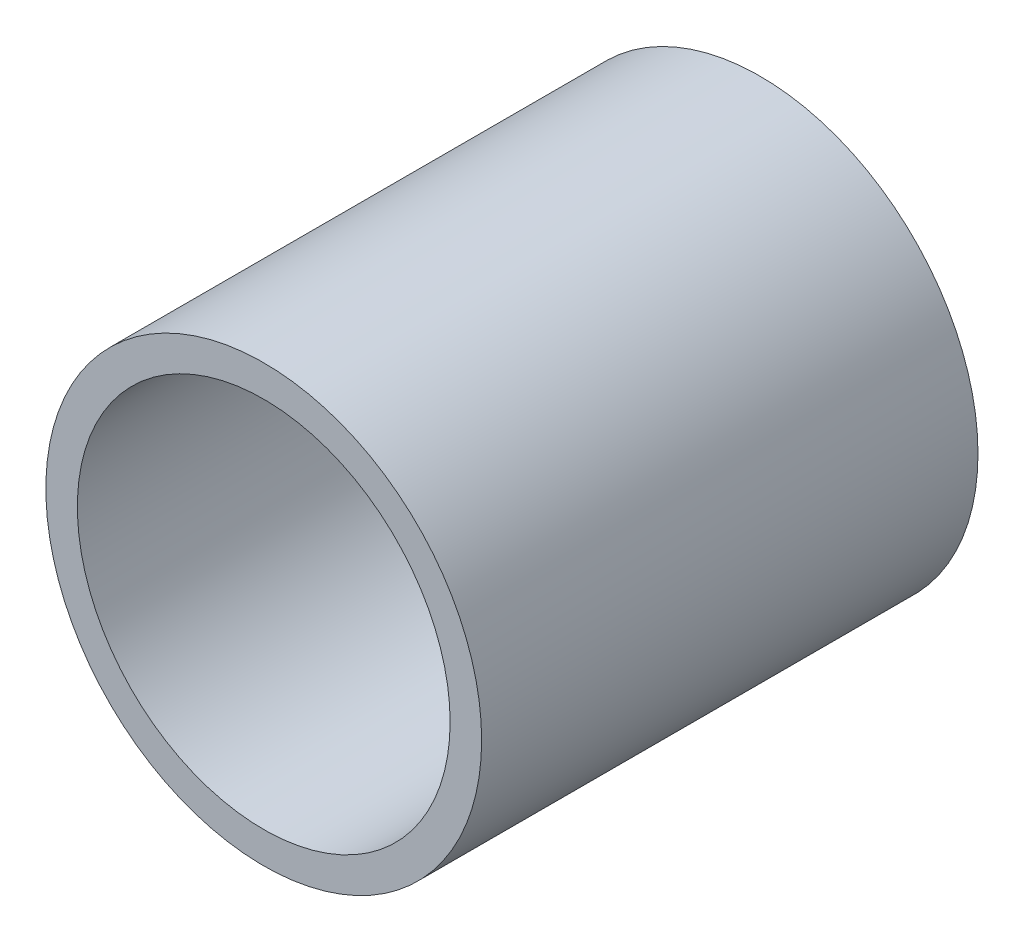
ISO-10303-21;
HEADER;
FILE_DESCRIPTION(('STEP AP214'),'2;1');
FILE_NAME('part.step','',(''),(''),'','','');
FILE_SCHEMA(('AUTOMOTIVE_DESIGN { 1 0 10303 214 1 1 1 1 }'));
ENDSEC;
DATA;
#1=APPLICATION_CONTEXT('core data for automotive mechanical design processes');
#2=APPLICATION_PROTOCOL_DEFINITION('international standard','automotive_design',2000,#1);
#3=PRODUCT_CONTEXT('',#1,'mechanical');
#4=PRODUCT('Part','Part','',(#3));
#5=PRODUCT_RELATED_PRODUCT_CATEGORY('part','',(#4));
#6=PRODUCT_DEFINITION_FORMATION('','',#4);
#7=PRODUCT_DEFINITION_CONTEXT('part definition',#1,'design');
#8=PRODUCT_DEFINITION('design','',#6,#7);
#9=PRODUCT_DEFINITION_SHAPE('','',#8);
#10=(LENGTH_UNIT() NAMED_UNIT(*) SI_UNIT(.MILLI.,.METRE.));
#11=(NAMED_UNIT(*) PLANE_ANGLE_UNIT() SI_UNIT($,.RADIAN.));
#12=(NAMED_UNIT(*) SI_UNIT($,.STERADIAN.) SOLID_ANGLE_UNIT());
#13=UNCERTAINTY_MEASURE_WITH_UNIT(LENGTH_MEASURE(1.E-05),#10,'distance_accuracy_value','');
#14=(GEOMETRIC_REPRESENTATION_CONTEXT(3) GLOBAL_UNCERTAINTY_ASSIGNED_CONTEXT((#13)) GLOBAL_UNIT_ASSIGNED_CONTEXT((#10,
#11,#12)) REPRESENTATION_CONTEXT('',''));
#15=CARTESIAN_POINT('',(0.,0.,0.));
#16=DIRECTION('',(0.,0.,1.));
#17=DIRECTION('',(1.,0.,0.));
#18=AXIS2_PLACEMENT_3D('',#15,#16,#17);
#19=CARTESIAN_POINT('',(0.,0.,12.7));
#20=DIRECTION('',(0.,0.,1.));
#21=DIRECTION('',(1.,0.,0.));
#22=AXIS2_PLACEMENT_3D('',#19,#20,#21);
#23=PLANE('',#22);
#24=CARTESIAN_POINT('',(0.,0.,12.7));
#25=DIRECTION('',(0.,0.,1.));
#26=DIRECTION('',(1.,0.,0.));
#27=AXIS2_PLACEMENT_3D('',#24,#25,#26);
#28=CIRCLE('',#27,11.1506);
#29=CARTESIAN_POINT('',(11.1506,0.,12.7));
#30=VERTEX_POINT('',#29);
#31=EDGE_CURVE('E10',#30,#30,#28,.T.);
#32=ORIENTED_EDGE('',*,*,#31,.T.);
#33=EDGE_LOOP('',(#32));
#34=FACE_BOUND('',#33,.T.);
#35=CARTESIAN_POINT('',(0.,0.,12.7));
#36=DIRECTION('',(0.,0.,1.));
#37=DIRECTION('',(1.,0.,0.));
#38=AXIS2_PLACEMENT_3D('',#35,#36,#37);
#39=CIRCLE('',#38,9.5377);
#40=CARTESIAN_POINT('',(9.5377,0.,12.7));
#41=VERTEX_POINT('',#40);
#42=EDGE_CURVE('E43',#41,#41,#39,.T.);
#43=ORIENTED_EDGE('',*,*,#42,.F.);
#44=EDGE_LOOP('',(#43));
#45=FACE_BOUND('',#44,.T.);
#46=ADVANCED_FACE('F32',(#34,#45),#23,.T.);
#47=CARTESIAN_POINT('',(0.,0.,-12.7));
#48=DIRECTION('',(0.,0.,1.));
#49=DIRECTION('',(1.,0.,0.));
#50=AXIS2_PLACEMENT_3D('',#47,#48,#49);
#51=PLANE('',#50);
#52=CARTESIAN_POINT('',(0.,0.,-12.7));
#53=DIRECTION('',(0.,0.,1.));
#54=DIRECTION('',(1.,0.,0.));
#55=AXIS2_PLACEMENT_3D('',#52,#53,#54);
#56=CIRCLE('',#55,11.1506);
#57=CARTESIAN_POINT('',(11.1506,0.,-12.7));
#58=VERTEX_POINT('',#57);
#59=EDGE_CURVE('E36',#58,#58,#56,.T.);
#60=ORIENTED_EDGE('',*,*,#59,.F.);
#61=EDGE_LOOP('',(#60));
#62=FACE_BOUND('',#61,.T.);
#63=CARTESIAN_POINT('',(0.,0.,-12.7));
#64=DIRECTION('',(0.,0.,1.));
#65=DIRECTION('',(1.,0.,0.));
#66=AXIS2_PLACEMENT_3D('',#63,#64,#65);
#67=CIRCLE('',#66,9.5377);
#68=CARTESIAN_POINT('',(9.5377,0.,-12.7));
#69=VERTEX_POINT('',#68);
#70=EDGE_CURVE('E45',#69,#69,#67,.T.);
#71=ORIENTED_EDGE('',*,*,#70,.T.);
#72=EDGE_LOOP('',(#71));
#73=FACE_BOUND('',#72,.T.);
#74=ADVANCED_FACE('F55',(#62,#73),#51,.F.);
#75=CARTESIAN_POINT('',(0.,0.,12.7));
#76=DIRECTION('',(0.,0.,-1.));
#77=DIRECTION('',(-1.,0.,0.));
#78=AXIS2_PLACEMENT_3D('',#75,#76,#77);
#79=CYLINDRICAL_SURFACE('',#78,11.1506);
#80=ORIENTED_EDGE('',*,*,#31,.F.);
#81=EDGE_LOOP('',(#80));
#82=FACE_BOUND('',#81,.T.);
#83=ORIENTED_EDGE('',*,*,#59,.T.);
#84=EDGE_LOOP('',(#83));
#85=FACE_BOUND('',#84,.T.);
#86=ADVANCED_FACE('F34',(#82,#85),#79,.T.);
#87=CARTESIAN_POINT('',(0.,0.,12.7));
#88=DIRECTION('',(0.,0.,-1.));
#89=DIRECTION('',(-1.,0.,0.));
#90=AXIS2_PLACEMENT_3D('',#87,#88,#89);
#91=CYLINDRICAL_SURFACE('',#90,9.5377);
#92=ORIENTED_EDGE('',*,*,#42,.T.);
#93=EDGE_LOOP('',(#92));
#94=FACE_BOUND('',#93,.T.);
#95=ORIENTED_EDGE('',*,*,#70,.F.);
#96=EDGE_LOOP('',(#95));
#97=FACE_BOUND('',#96,.T.);
#98=ADVANCED_FACE('F51',(#94,#97),#91,.F.);
#99=CLOSED_SHELL('',(#46,#74,#86,#98));
#100=MANIFOLD_SOLID_BREP('B2',#99);
#101=ADVANCED_BREP_SHAPE_REPRESENTATION('',(#18,#100),#14);
#102=SHAPE_DEFINITION_REPRESENTATION(#9,#101);
ENDSEC;
END-ISO-10303-21;
